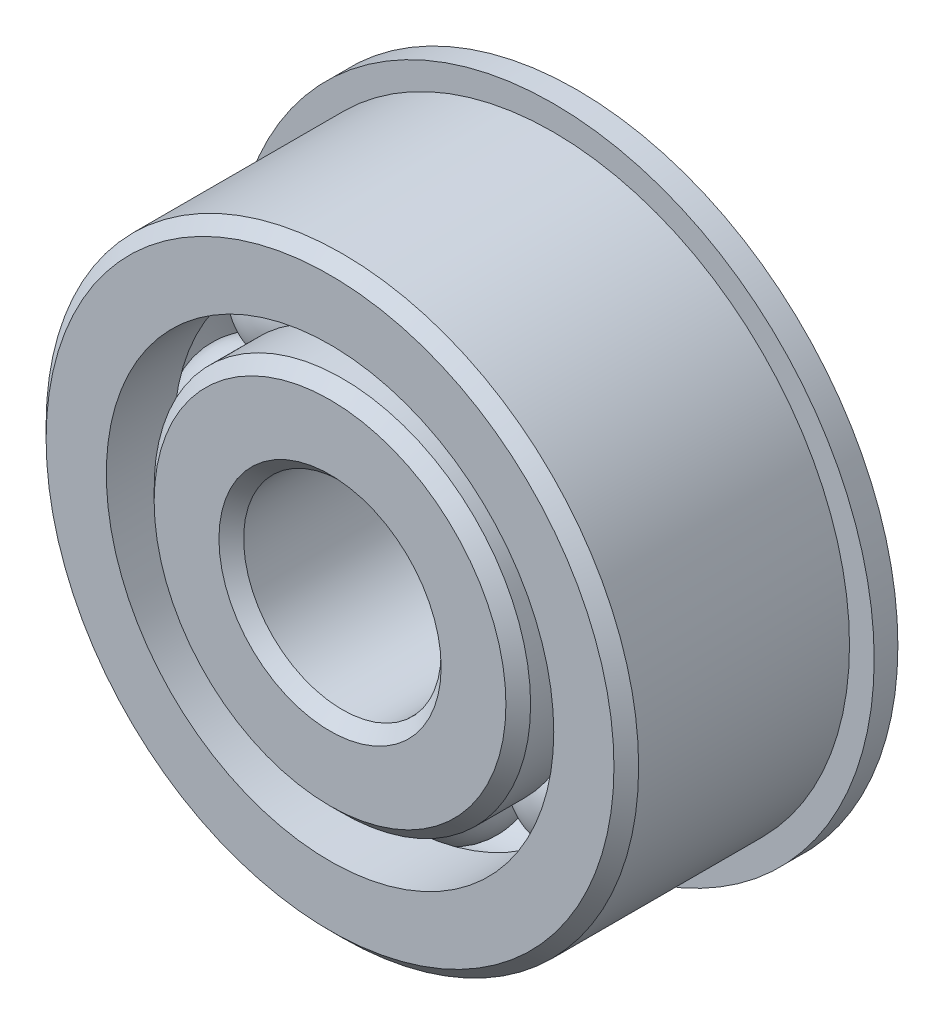
ISO-10303-21;
HEADER;
FILE_DESCRIPTION(('STEP AP214'),'2;1');
FILE_NAME('part.step','',(''),(''),'','','');
FILE_SCHEMA(('AUTOMOTIVE_DESIGN { 1 0 10303 214 1 1 1 1 }'));
ENDSEC;
DATA;
#1=APPLICATION_CONTEXT('core data for automotive mechanical design processes');
#2=APPLICATION_PROTOCOL_DEFINITION('international standard','automotive_design',2000,#1);
#3=PRODUCT_CONTEXT('',#1,'mechanical');
#4=PRODUCT('Part','Part','',(#3));
#5=PRODUCT_RELATED_PRODUCT_CATEGORY('part','',(#4));
#6=PRODUCT_DEFINITION_FORMATION('','',#4);
#7=PRODUCT_DEFINITION_CONTEXT('part definition',#1,'design');
#8=PRODUCT_DEFINITION('design','',#6,#7);
#9=PRODUCT_DEFINITION_SHAPE('','',#8);
#10=(LENGTH_UNIT() NAMED_UNIT(*) SI_UNIT(.MILLI.,.METRE.));
#11=(NAMED_UNIT(*) PLANE_ANGLE_UNIT() SI_UNIT($,.RADIAN.));
#12=(NAMED_UNIT(*) SI_UNIT($,.STERADIAN.) SOLID_ANGLE_UNIT());
#13=UNCERTAINTY_MEASURE_WITH_UNIT(LENGTH_MEASURE(1.E-05),#10,'distance_accuracy_value','');
#14=(GEOMETRIC_REPRESENTATION_CONTEXT(3) GLOBAL_UNCERTAINTY_ASSIGNED_CONTEXT((#13)) GLOBAL_UNIT_ASSIGNED_CONTEXT((#10,
#11,#12)) REPRESENTATION_CONTEXT('',''));
#15=CARTESIAN_POINT('',(0.,0.,0.));
#16=DIRECTION('',(0.,0.,1.));
#17=DIRECTION('',(1.,0.,0.));
#18=AXIS2_PLACEMENT_3D('',#15,#16,#17);
#19=CARTESIAN_POINT('',(-8.98025612106904,8.98025612106927,0.));
#20=DIRECTION('',(0.,0.,1.));
#21=DIRECTION('',(-0.70710678118654,0.707106781186556,0.));
#22=AXIS2_PLACEMENT_3D('',#19,#20,#21);
#23=SPHERICAL_SURFACE('',#22,3.96875);
#24=CARTESIAN_POINT('',(-8.98025612106904,8.98025612106927,3.96875000000003));
#25=VERTEX_POINT('',#24);
#26=VERTEX_LOOP('',#25);
#27=FACE_BOUND('',#26,.T.);
#28=ADVANCED_FACE('F41',(#27),#23,.T.);
#29=CLOSED_SHELL('',(#28));
#30=MANIFOLD_SOLID_BREP('B2',#29);
#31=CARTESIAN_POINT('',(-12.7,1.31838984174237E-13,0.));
#32=DIRECTION('',(0.,0.,1.));
#33=DIRECTION('',(-1.,0.,0.));
#34=AXIS2_PLACEMENT_3D('',#31,#32,#33);
#35=SPHERICAL_SURFACE('',#34,3.96875);
#36=CARTESIAN_POINT('',(-12.7,1.31849378578076E-13,3.96875));
#37=VERTEX_POINT('',#36);
#38=VERTEX_LOOP('',#37);
#39=FACE_BOUND('',#38,.T.);
#40=ADVANCED_FACE('F65',(#39),#35,.T.);
#41=CLOSED_SHELL('',(#40));
#42=MANIFOLD_SOLID_BREP('B6',#41);
#43=CARTESIAN_POINT('',(-8.98025612106923,-8.98025612106907,0.));
#44=DIRECTION('',(0.,0.,1.));
#45=DIRECTION('',(-0.707106781186554,-0.707106781186541,0.));
#46=AXIS2_PLACEMENT_3D('',#43,#44,#45);
#47=SPHERICAL_SURFACE('',#46,3.96875);
#48=CARTESIAN_POINT('',(-8.98025612106923,-8.98025612106907,3.96875));
#49=VERTEX_POINT('',#48);
#50=VERTEX_LOOP('',#49);
#51=FACE_BOUND('',#50,.T.);
#52=ADVANCED_FACE('F89',(#51),#47,.T.);
#53=CLOSED_SHELL('',(#52));
#54=MANIFOLD_SOLID_BREP('B37',#53);
#55=CARTESIAN_POINT('',(0.,-12.7,0.));
#56=DIRECTION('',(0.,0.,1.));
#57=DIRECTION('',(0.,-1.,0.));
#58=AXIS2_PLACEMENT_3D('',#55,#56,#57);
#59=SPHERICAL_SURFACE('',#58,3.96875);
#60=CARTESIAN_POINT('',(0.,-12.7,3.96875));
#61=VERTEX_POINT('',#60);
#62=VERTEX_LOOP('',#61);
#63=FACE_BOUND('',#62,.T.);
#64=ADVANCED_FACE('F113',(#63),#59,.T.);
#65=CLOSED_SHELL('',(#64));
#66=MANIFOLD_SOLID_BREP('B61',#65);
#67=CARTESIAN_POINT('',(8.98025612106912,-8.98025612106918,0.));
#68=DIRECTION('',(0.,0.,1.));
#69=DIRECTION('',(0.707106781186544,-0.707106781186551,0.));
#70=AXIS2_PLACEMENT_3D('',#67,#68,#69);
#71=SPHERICAL_SURFACE('',#70,3.96875);
#72=CARTESIAN_POINT('',(8.98025612106912,-8.98025612106918,3.96875));
#73=VERTEX_POINT('',#72);
#74=VERTEX_LOOP('',#73);
#75=FACE_BOUND('',#74,.T.);
#76=ADVANCED_FACE('F137',(#75),#71,.T.);
#77=CLOSED_SHELL('',(#76));
#78=MANIFOLD_SOLID_BREP('B85',#77);
#79=CARTESIAN_POINT('',(12.7,0.,0.));
#80=DIRECTION('',(0.,0.,1.));
#81=DIRECTION('',(1.,0.,0.));
#82=AXIS2_PLACEMENT_3D('',#79,#80,#81);
#83=SPHERICAL_SURFACE('',#82,3.96875);
#84=CARTESIAN_POINT('',(12.7,0.,3.96875));
#85=VERTEX_POINT('',#84);
#86=VERTEX_LOOP('',#85);
#87=FACE_BOUND('',#86,.T.);
#88=ADVANCED_FACE('F161',(#87),#83,.T.);
#89=CLOSED_SHELL('',(#88));
#90=MANIFOLD_SOLID_BREP('B109',#89);
#91=CARTESIAN_POINT('',(8.9802561210692,8.98025612106915,0.));
#92=DIRECTION('',(0.,0.,1.));
#93=DIRECTION('',(0.707106781186549,0.707106781186547,0.));
#94=AXIS2_PLACEMENT_3D('',#91,#92,#93);
#95=SPHERICAL_SURFACE('',#94,3.96875);
#96=CARTESIAN_POINT('',(8.9802561210692,8.98025612106915,3.96875));
#97=VERTEX_POINT('',#96);
#98=VERTEX_LOOP('',#97);
#99=FACE_BOUND('',#98,.T.);
#100=ADVANCED_FACE('F185',(#99),#95,.T.);
#101=CLOSED_SHELL('',(#100));
#102=MANIFOLD_SOLID_BREP('B133',#101);
#103=CARTESIAN_POINT('',(0.,12.7,0.));
#104=DIRECTION('',(0.,0.,1.));
#105=DIRECTION('',(0.,1.,0.));
#106=AXIS2_PLACEMENT_3D('',#103,#104,#105);
#107=SPHERICAL_SURFACE('',#106,3.96875);
#108=CARTESIAN_POINT('',(0.,12.7,3.96875000000003));
#109=VERTEX_POINT('',#108);
#110=VERTEX_LOOP('',#109);
#111=FACE_BOUND('',#110,.T.);
#112=ADVANCED_FACE('F211',(#111),#107,.T.);
#113=CLOSED_SHELL('',(#112));
#114=MANIFOLD_SOLID_BREP('B157',#113);
#115=CARTESIAN_POINT('',(0.,0.,7.14375));
#116=DIRECTION('',(0.,0.,-1.));
#117=DIRECTION('',(-1.,0.,0.));
#118=AXIS2_PLACEMENT_3D('',#115,#116,#117);
#119=CONICAL_SURFACE('',#118,12.1031,0.785398163397446);
#120=CARTESIAN_POINT('',(0.,0.,7.9375));
#121=DIRECTION('',(0.,0.,1.));
#122=DIRECTION('',(1.,0.,0.));
#123=AXIS2_PLACEMENT_3D('',#120,#121,#122);
#124=CIRCLE('',#123,11.30935);
#125=CARTESIAN_POINT('',(11.30935,0.,7.9375));
#126=VERTEX_POINT('',#125);
#127=EDGE_CURVE('E210',#126,#126,#124,.T.);
#128=ORIENTED_EDGE('',*,*,#127,.F.);
#129=EDGE_LOOP('',(#128));
#130=FACE_BOUND('',#129,.T.);
#131=CARTESIAN_POINT('',(0.,0.,7.14375));
#132=DIRECTION('',(0.,0.,1.));
#133=DIRECTION('',(1.,0.,0.));
#134=AXIS2_PLACEMENT_3D('',#131,#132,#133);
#135=CIRCLE('',#134,12.1031);
#136=CARTESIAN_POINT('',(12.1031,0.,7.14375));
#137=VERTEX_POINT('',#136);
#138=EDGE_CURVE('E268',#137,#137,#135,.T.);
#139=ORIENTED_EDGE('',*,*,#138,.T.);
#140=EDGE_LOOP('',(#139));
#141=FACE_BOUND('',#140,.T.);
#142=ADVANCED_FACE('F234',(#130,#141),#119,.T.);
#143=CARTESIAN_POINT('',(0.,7.14375000000001,7.93750000000003));
#144=DIRECTION('',(0.,0.,-1.));
#145=DIRECTION('',(-1.,0.,0.));
#146=AXIS2_PLACEMENT_3D('',#143,#144,#145);
#147=PLANE('',#146);
#148=CARTESIAN_POINT('',(0.,0.,7.9375));
#149=DIRECTION('',(0.,0.,1.));
#150=DIRECTION('',(1.,0.,0.));
#151=AXIS2_PLACEMENT_3D('',#148,#149,#150);
#152=CIRCLE('',#151,7.14375);
#153=CARTESIAN_POINT('',(7.14375,0.,7.9375));
#154=VERTEX_POINT('',#153);
#155=EDGE_CURVE('E240',#154,#154,#152,.T.);
#156=ORIENTED_EDGE('',*,*,#155,.F.);
#157=EDGE_LOOP('',(#156));
#158=FACE_BOUND('',#157,.T.);
#159=ORIENTED_EDGE('',*,*,#127,.T.);
#160=EDGE_LOOP('',(#159));
#161=FACE_BOUND('',#160,.T.);
#162=ADVANCED_FACE('F317',(#158,#161),#147,.F.);
#163=CARTESIAN_POINT('',(0.,0.,7.9375));
#164=DIRECTION('',(0.,0.,1.));
#165=DIRECTION('',(1.,0.,0.));
#166=AXIS2_PLACEMENT_3D('',#163,#164,#165);
#167=CONICAL_SURFACE('',#166,7.14375,0.785398163397451);
#168=CARTESIAN_POINT('',(0.,0.,7.14375));
#169=DIRECTION('',(0.,0.,1.));
#170=DIRECTION('',(1.,0.,0.));
#171=AXIS2_PLACEMENT_3D('',#168,#169,#170);
#172=CIRCLE('',#171,6.35);
#173=CARTESIAN_POINT('',(6.35,0.,7.14375));
#174=VERTEX_POINT('',#173);
#175=EDGE_CURVE('E244',#174,#174,#172,.T.);
#176=ORIENTED_EDGE('',*,*,#175,.F.);
#177=EDGE_LOOP('',(#176));
#178=FACE_BOUND('',#177,.T.);
#179=ORIENTED_EDGE('',*,*,#155,.T.);
#180=EDGE_LOOP('',(#179));
#181=FACE_BOUND('',#180,.T.);
#182=ADVANCED_FACE('F312',(#178,#181),#167,.F.);
#183=CARTESIAN_POINT('',(0.,0.,7.9375));
#184=DIRECTION('',(0.,0.,1.));
#185=DIRECTION('',(1.,0.,0.));
#186=AXIS2_PLACEMENT_3D('',#183,#184,#185);
#187=CYLINDRICAL_SURFACE('',#186,6.35);
#188=CARTESIAN_POINT('',(0.,0.,-8.74395));
#189=DIRECTION('',(0.,0.,1.));
#190=DIRECTION('',(1.,0.,0.));
#191=AXIS2_PLACEMENT_3D('',#188,#189,#190);
#192=CIRCLE('',#191,6.35);
#193=CARTESIAN_POINT('',(6.35,0.,-8.74395));
#194=VERTEX_POINT('',#193);
#195=EDGE_CURVE('E248',#194,#194,#192,.T.);
#196=ORIENTED_EDGE('',*,*,#195,.F.);
#197=EDGE_LOOP('',(#196));
#198=FACE_BOUND('',#197,.T.);
#199=ORIENTED_EDGE('',*,*,#175,.T.);
#200=EDGE_LOOP('',(#199));
#201=FACE_BOUND('',#200,.T.);
#202=ADVANCED_FACE('F306',(#198,#201),#187,.F.);
#203=CARTESIAN_POINT('',(0.,0.,-8.74395));
#204=DIRECTION('',(0.,0.,-1.));
#205=DIRECTION('',(-1.,0.,0.));
#206=AXIS2_PLACEMENT_3D('',#203,#204,#205);
#207=CONICAL_SURFACE('',#206,6.35,0.785398163397448);
#208=CARTESIAN_POINT('',(0.,0.,-9.5377));
#209=DIRECTION('',(0.,0.,1.));
#210=DIRECTION('',(1.,0.,0.));
#211=AXIS2_PLACEMENT_3D('',#208,#209,#210);
#212=CIRCLE('',#211,7.14375);
#213=CARTESIAN_POINT('',(7.14375,0.,-9.5377));
#214=VERTEX_POINT('',#213);
#215=EDGE_CURVE('E253',#214,#214,#212,.T.);
#216=ORIENTED_EDGE('',*,*,#215,.F.);
#217=EDGE_LOOP('',(#216));
#218=FACE_BOUND('',#217,.T.);
#219=ORIENTED_EDGE('',*,*,#195,.T.);
#220=EDGE_LOOP('',(#219));
#221=FACE_BOUND('',#220,.T.);
#222=ADVANCED_FACE('F300',(#218,#221),#207,.F.);
#223=CARTESIAN_POINT('',(0.,11.30935,-9.53769999999997));
#224=DIRECTION('',(0.,0.,1.));
#225=DIRECTION('',(1.,0.,0.));
#226=AXIS2_PLACEMENT_3D('',#223,#224,#225);
#227=PLANE('',#226);
#228=CARTESIAN_POINT('',(0.,0.,-9.5377));
#229=DIRECTION('',(0.,0.,1.));
#230=DIRECTION('',(1.,0.,0.));
#231=AXIS2_PLACEMENT_3D('',#228,#229,#230);
#232=CIRCLE('',#231,11.30935);
#233=CARTESIAN_POINT('',(11.30935,0.,-9.5377));
#234=VERTEX_POINT('',#233);
#235=EDGE_CURVE('E256',#234,#234,#232,.T.);
#236=ORIENTED_EDGE('',*,*,#235,.F.);
#237=EDGE_LOOP('',(#236));
#238=FACE_BOUND('',#237,.T.);
#239=ORIENTED_EDGE('',*,*,#215,.T.);
#240=EDGE_LOOP('',(#239));
#241=FACE_BOUND('',#240,.T.);
#242=ADVANCED_FACE('F294',(#238,#241),#227,.F.);
#243=CARTESIAN_POINT('',(0.,0.,-9.5377));
#244=DIRECTION('',(0.,0.,1.));
#245=DIRECTION('',(1.,0.,0.));
#246=AXIS2_PLACEMENT_3D('',#243,#244,#245);
#247=CONICAL_SURFACE('',#246,11.30935,0.785398163397445);
#248=CARTESIAN_POINT('',(0.,0.,-8.74395));
#249=DIRECTION('',(0.,0.,1.));
#250=DIRECTION('',(1.,0.,0.));
#251=AXIS2_PLACEMENT_3D('',#248,#249,#250);
#252=CIRCLE('',#251,12.1031);
#253=CARTESIAN_POINT('',(12.1031,0.,-8.74395));
#254=VERTEX_POINT('',#253);
#255=EDGE_CURVE('E259',#254,#254,#252,.T.);
#256=ORIENTED_EDGE('',*,*,#255,.F.);
#257=EDGE_LOOP('',(#256));
#258=FACE_BOUND('',#257,.T.);
#259=ORIENTED_EDGE('',*,*,#235,.T.);
#260=EDGE_LOOP('',(#259));
#261=FACE_BOUND('',#260,.T.);
#262=ADVANCED_FACE('F288',(#258,#261),#247,.T.);
#263=CARTESIAN_POINT('',(0.,0.,7.9375));
#264=DIRECTION('',(0.,0.,1.));
#265=DIRECTION('',(1.,0.,0.));
#266=AXIS2_PLACEMENT_3D('',#263,#264,#265);
#267=CYLINDRICAL_SURFACE('',#266,12.1031);
#268=CARTESIAN_POINT('',(0.,0.,-3.92360637073853));
#269=DIRECTION('',(0.,0.,1.));
#270=DIRECTION('',(1.,0.,0.));
#271=AXIS2_PLACEMENT_3D('',#268,#269,#270);
#272=CIRCLE('',#271,12.1031);
#273=CARTESIAN_POINT('',(12.1031,0.,-3.92360637073853));
#274=VERTEX_POINT('',#273);
#275=EDGE_CURVE('E262',#274,#274,#272,.T.);
#276=ORIENTED_EDGE('',*,*,#275,.F.);
#277=EDGE_LOOP('',(#276));
#278=FACE_BOUND('',#277,.T.);
#279=ORIENTED_EDGE('',*,*,#255,.T.);
#280=EDGE_LOOP('',(#279));
#281=FACE_BOUND('',#280,.T.);
#282=ADVANCED_FACE('F282',(#278,#281),#267,.T.);
#283=CARTESIAN_POINT('',(0.,0.,0.));
#284=DIRECTION('',(0.,0.,1.));
#285=DIRECTION('',(1.,0.,0.));
#286=AXIS2_PLACEMENT_3D('',#283,#284,#285);
#287=TOROIDAL_SURFACE('',#286,12.7,3.96875);
#288=CARTESIAN_POINT('',(0.,0.,3.92360637073855));
#289=DIRECTION('',(0.,0.,1.));
#290=DIRECTION('',(1.,0.,0.));
#291=AXIS2_PLACEMENT_3D('',#288,#289,#290);
#292=CIRCLE('',#291,12.1031);
#293=CARTESIAN_POINT('',(12.1031,0.,3.92360637073855));
#294=VERTEX_POINT('',#293);
#295=EDGE_CURVE('E265',#294,#294,#292,.T.);
#296=ORIENTED_EDGE('',*,*,#295,.F.);
#297=EDGE_LOOP('',(#296));
#298=FACE_BOUND('',#297,.T.);
#299=ORIENTED_EDGE('',*,*,#275,.T.);
#300=EDGE_LOOP('',(#299));
#301=FACE_BOUND('',#300,.T.);
#302=ADVANCED_FACE('F276',(#298,#301),#287,.F.);
#303=CARTESIAN_POINT('',(0.,0.,7.9375));
#304=DIRECTION('',(0.,0.,1.));
#305=DIRECTION('',(1.,0.,0.));
#306=AXIS2_PLACEMENT_3D('',#303,#304,#305);
#307=CYLINDRICAL_SURFACE('',#306,12.1031);
#308=ORIENTED_EDGE('',*,*,#138,.F.);
#309=EDGE_LOOP('',(#308));
#310=FACE_BOUND('',#309,.T.);
#311=ORIENTED_EDGE('',*,*,#295,.T.);
#312=EDGE_LOOP('',(#311));
#313=FACE_BOUND('',#312,.T.);
#314=ADVANCED_FACE('F273',(#310,#313),#307,.T.);
#315=CLOSED_SHELL('',(#142,#162,#182,#202,#222,#242,#262,#282,#302,#314));
#316=MANIFOLD_SOLID_BREP('B181',#315);
#317=CARTESIAN_POINT('',(0.,0.,7.14374999999999));
#318=DIRECTION('',(0.,0.,-1.));
#319=DIRECTION('',(-1.,0.,0.));
#320=AXIS2_PLACEMENT_3D('',#317,#318,#319);
#321=CONICAL_SURFACE('',#320,19.05,0.785398163397445);
#322=CARTESIAN_POINT('',(0.,0.,7.9375));
#323=DIRECTION('',(0.,0.,1.));
#324=DIRECTION('',(1.,0.,0.));
#325=AXIS2_PLACEMENT_3D('',#322,#323,#324);
#326=CIRCLE('',#325,18.25625);
#327=CARTESIAN_POINT('',(18.25625,0.,7.9375));
#328=VERTEX_POINT('',#327);
#329=EDGE_CURVE('E447',#328,#328,#326,.T.);
#330=ORIENTED_EDGE('',*,*,#329,.F.);
#331=EDGE_LOOP('',(#330));
#332=FACE_BOUND('',#331,.T.);
#333=CARTESIAN_POINT('',(0.,0.,7.14374999999999));
#334=DIRECTION('',(0.,0.,1.));
#335=DIRECTION('',(1.,0.,0.));
#336=AXIS2_PLACEMENT_3D('',#333,#334,#335);
#337=CIRCLE('',#336,19.05);
#338=CARTESIAN_POINT('',(19.05,0.,7.14374999999999));
#339=VERTEX_POINT('',#338);
#340=EDGE_CURVE('E233',#339,#339,#337,.T.);
#341=ORIENTED_EDGE('',*,*,#340,.T.);
#342=EDGE_LOOP('',(#341));
#343=FACE_BOUND('',#342,.T.);
#344=ADVANCED_FACE('F425',(#332,#343),#321,.T.);
#345=CARTESIAN_POINT('',(0.,0.,7.9375));
#346=DIRECTION('',(0.,0.,1.));
#347=DIRECTION('',(1.,0.,0.));
#348=AXIS2_PLACEMENT_3D('',#345,#346,#347);
#349=CYLINDRICAL_SURFACE('',#348,19.05);
#350=CARTESIAN_POINT('',(0.,0.,-6.4135));
#351=DIRECTION('',(0.,0.,1.));
#352=DIRECTION('',(1.,0.,0.));
#353=AXIS2_PLACEMENT_3D('',#350,#351,#352);
#354=CIRCLE('',#353,19.05);
#355=CARTESIAN_POINT('',(19.05,0.,-6.4135));
#356=VERTEX_POINT('',#355);
#357=EDGE_CURVE('E450',#356,#356,#354,.T.);
#358=ORIENTED_EDGE('',*,*,#357,.T.);
#359=EDGE_LOOP('',(#358));
#360=FACE_BOUND('',#359,.T.);
#361=ORIENTED_EDGE('',*,*,#340,.F.);
#362=EDGE_LOOP('',(#361));
#363=FACE_BOUND('',#362,.T.);
#364=ADVANCED_FACE('F470',(#360,#363),#349,.T.);
#365=CARTESIAN_POINT('',(0.,18.25625,-7.93749999999997));
#366=DIRECTION('',(0.,0.,1.));
#367=DIRECTION('',(1.,0.,0.));
#368=AXIS2_PLACEMENT_3D('',#365,#366,#367);
#369=PLANE('',#368);
#370=CARTESIAN_POINT('',(0.,0.,-7.9375));
#371=DIRECTION('',(0.,0.,1.));
#372=DIRECTION('',(1.,0.,0.));
#373=AXIS2_PLACEMENT_3D('',#370,#371,#372);
#374=CIRCLE('',#373,14.385925);
#375=CARTESIAN_POINT('',(14.385925,0.,-7.9375));
#376=VERTEX_POINT('',#375);
#377=EDGE_CURVE('E431',#376,#376,#374,.T.);
#378=ORIENTED_EDGE('',*,*,#377,.T.);
#379=EDGE_LOOP('',(#378));
#380=FACE_BOUND('',#379,.T.);
#381=CARTESIAN_POINT('',(0.,0.,-7.9375));
#382=DIRECTION('',(0.,0.,-1.));
#383=DIRECTION('',(-1.,0.,0.));
#384=AXIS2_PLACEMENT_3D('',#381,#382,#383);
#385=CIRCLE('',#384,20.6375);
#386=CARTESIAN_POINT('',(-20.6375,0.,-7.9375));
#387=VERTEX_POINT('',#386);
#388=EDGE_CURVE('E453',#387,#387,#385,.T.);
#389=ORIENTED_EDGE('',*,*,#388,.T.);
#390=EDGE_LOOP('',(#389));
#391=FACE_BOUND('',#390,.T.);
#392=ADVANCED_FACE('F473',(#380,#391),#369,.F.);
#393=CARTESIAN_POINT('',(0.,0.,7.9375));
#394=DIRECTION('',(0.,0.,1.));
#395=DIRECTION('',(1.,0.,0.));
#396=AXIS2_PLACEMENT_3D('',#393,#394,#395);
#397=CYLINDRICAL_SURFACE('',#396,14.385925);
#398=CARTESIAN_POINT('',(0.,0.,-3.5928586747707));
#399=DIRECTION('',(0.,0.,1.));
#400=DIRECTION('',(1.,0.,0.));
#401=AXIS2_PLACEMENT_3D('',#398,#399,#400);
#402=CIRCLE('',#401,14.385925);
#403=CARTESIAN_POINT('',(14.385925,0.,-3.5928586747707));
#404=VERTEX_POINT('',#403);
#405=EDGE_CURVE('E435',#404,#404,#402,.T.);
#406=ORIENTED_EDGE('',*,*,#405,.T.);
#407=EDGE_LOOP('',(#406));
#408=FACE_BOUND('',#407,.T.);
#409=ORIENTED_EDGE('',*,*,#377,.F.);
#410=EDGE_LOOP('',(#409));
#411=FACE_BOUND('',#410,.T.);
#412=ADVANCED_FACE('F478',(#408,#411),#397,.F.);
#413=CARTESIAN_POINT('',(0.,0.,0.));
#414=DIRECTION('',(0.,0.,1.));
#415=DIRECTION('',(1.,0.,0.));
#416=AXIS2_PLACEMENT_3D('',#413,#414,#415);
#417=TOROIDAL_SURFACE('',#416,12.7,3.96875);
#418=ORIENTED_EDGE('',*,*,#405,.F.);
#419=EDGE_LOOP('',(#418));
#420=FACE_BOUND('',#419,.T.);
#421=CARTESIAN_POINT('',(0.,0.,3.5928586747707));
#422=DIRECTION('',(0.,0.,1.));
#423=DIRECTION('',(1.,0.,0.));
#424=AXIS2_PLACEMENT_3D('',#421,#422,#423);
#425=CIRCLE('',#424,14.385925);
#426=CARTESIAN_POINT('',(14.385925,0.,3.5928586747707));
#427=VERTEX_POINT('',#426);
#428=EDGE_CURVE('E439',#427,#427,#425,.T.);
#429=ORIENTED_EDGE('',*,*,#428,.T.);
#430=EDGE_LOOP('',(#429));
#431=FACE_BOUND('',#430,.T.);
#432=ADVANCED_FACE('F484',(#420,#431),#417,.F.);
#433=CARTESIAN_POINT('',(0.,0.,7.9375));
#434=DIRECTION('',(0.,0.,1.));
#435=DIRECTION('',(1.,0.,0.));
#436=AXIS2_PLACEMENT_3D('',#433,#434,#435);
#437=CYLINDRICAL_SURFACE('',#436,14.385925);
#438=ORIENTED_EDGE('',*,*,#428,.F.);
#439=EDGE_LOOP('',(#438));
#440=FACE_BOUND('',#439,.T.);
#441=CARTESIAN_POINT('',(0.,0.,7.9375));
#442=DIRECTION('',(0.,0.,1.));
#443=DIRECTION('',(1.,0.,0.));
#444=AXIS2_PLACEMENT_3D('',#441,#442,#443);
#445=CIRCLE('',#444,14.385925);
#446=CARTESIAN_POINT('',(14.385925,0.,7.9375));
#447=VERTEX_POINT('',#446);
#448=EDGE_CURVE('E444',#447,#447,#445,.T.);
#449=ORIENTED_EDGE('',*,*,#448,.T.);
#450=EDGE_LOOP('',(#449));
#451=FACE_BOUND('',#450,.T.);
#452=ADVANCED_FACE('F488',(#440,#451),#437,.F.);
#453=CARTESIAN_POINT('',(0.,18.25625,7.93750000000003));
#454=DIRECTION('',(0.,0.,-1.));
#455=DIRECTION('',(-1.,0.,0.));
#456=AXIS2_PLACEMENT_3D('',#453,#454,#455);
#457=PLANE('',#456);
#458=ORIENTED_EDGE('',*,*,#448,.F.);
#459=EDGE_LOOP('',(#458));
#460=FACE_BOUND('',#459,.T.);
#461=ORIENTED_EDGE('',*,*,#329,.T.);
#462=EDGE_LOOP('',(#461));
#463=FACE_BOUND('',#462,.T.);
#464=ADVANCED_FACE('F466',(#460,#463),#457,.F.);
#465=CARTESIAN_POINT('',(0.,14.385925,-6.41349999999998));
#466=DIRECTION('',(0.,0.,1.));
#467=DIRECTION('',(1.,0.,0.));
#468=AXIS2_PLACEMENT_3D('',#465,#466,#467);
#469=PLANE('',#468);
#470=CARTESIAN_POINT('',(0.,0.,-6.4135));
#471=DIRECTION('',(0.,0.,-1.));
#472=DIRECTION('',(-1.,0.,0.));
#473=AXIS2_PLACEMENT_3D('',#470,#471,#472);
#474=CIRCLE('',#473,20.6375);
#475=CARTESIAN_POINT('',(-20.6375,0.,-6.4135));
#476=VERTEX_POINT('',#475);
#477=EDGE_CURVE('E456',#476,#476,#474,.T.);
#478=ORIENTED_EDGE('',*,*,#477,.F.);
#479=EDGE_LOOP('',(#478));
#480=FACE_BOUND('',#479,.T.);
#481=ORIENTED_EDGE('',*,*,#357,.F.);
#482=EDGE_LOOP('',(#481));
#483=FACE_BOUND('',#482,.T.);
#484=ADVANCED_FACE('F463',(#480,#483),#469,.T.);
#485=CARTESIAN_POINT('',(0.,0.,-7.9375));
#486=DIRECTION('',(0.,0.,-1.));
#487=DIRECTION('',(-1.,0.,0.));
#488=AXIS2_PLACEMENT_3D('',#485,#486,#487);
#489=CYLINDRICAL_SURFACE('',#488,20.6375);
#490=ORIENTED_EDGE('',*,*,#477,.T.);
#491=EDGE_LOOP('',(#490));
#492=FACE_BOUND('',#491,.T.);
#493=ORIENTED_EDGE('',*,*,#388,.F.);
#494=EDGE_LOOP('',(#493));
#495=FACE_BOUND('',#494,.T.);
#496=ADVANCED_FACE('F460',(#492,#495),#489,.T.);
#497=CLOSED_SHELL('',(#344,#364,#392,#412,#432,#452,#464,#484,#496));
#498=MANIFOLD_SOLID_BREP('B205',#497);
#499=ADVANCED_BREP_SHAPE_REPRESENTATION('',(#18,#30,#42,#54,#66,#78,#90,#102,#114,#316,#498),#14);
#500=SHAPE_DEFINITION_REPRESENTATION(#9,#499);
ENDSEC;
END-ISO-10303-21;
